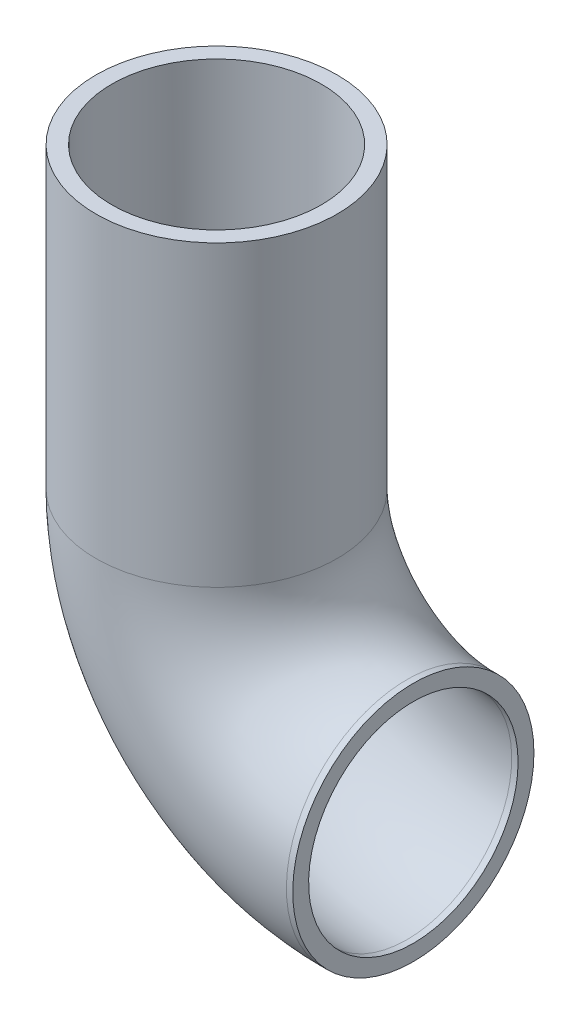
ISO-10303-21;
HEADER;
FILE_DESCRIPTION(('STEP AP214'),'2;1');
FILE_NAME('part.step','',(''),(''),'','','');
FILE_SCHEMA(('AUTOMOTIVE_DESIGN { 1 0 10303 214 1 1 1 1 }'));
ENDSEC;
DATA;
#1=APPLICATION_CONTEXT('core data for automotive mechanical design processes');
#2=APPLICATION_PROTOCOL_DEFINITION('international standard','automotive_design',2000,#1);
#3=PRODUCT_CONTEXT('',#1,'mechanical');
#4=PRODUCT('Part','Part','',(#3));
#5=PRODUCT_RELATED_PRODUCT_CATEGORY('part','',(#4));
#6=PRODUCT_DEFINITION_FORMATION('','',#4);
#7=PRODUCT_DEFINITION_CONTEXT('part definition',#1,'design');
#8=PRODUCT_DEFINITION('design','',#6,#7);
#9=PRODUCT_DEFINITION_SHAPE('','',#8);
#10=(LENGTH_UNIT() NAMED_UNIT(*) SI_UNIT(.MILLI.,.METRE.));
#11=(NAMED_UNIT(*) PLANE_ANGLE_UNIT() SI_UNIT($,.RADIAN.));
#12=(NAMED_UNIT(*) SI_UNIT($,.STERADIAN.) SOLID_ANGLE_UNIT());
#13=UNCERTAINTY_MEASURE_WITH_UNIT(LENGTH_MEASURE(1.E-05),#10,'distance_accuracy_value','');
#14=(GEOMETRIC_REPRESENTATION_CONTEXT(3) GLOBAL_UNCERTAINTY_ASSIGNED_CONTEXT((#13)) GLOBAL_UNIT_ASSIGNED_CONTEXT((#10,
#11,#12)) REPRESENTATION_CONTEXT('',''));
#15=CARTESIAN_POINT('',(0.,0.,0.));
#16=DIRECTION('',(0.,0.,1.));
#17=DIRECTION('',(1.,0.,0.));
#18=AXIS2_PLACEMENT_3D('',#15,#16,#17);
#19=CARTESIAN_POINT('',(0.,0.,0.));
#20=DIRECTION('',(1.,0.,0.));
#21=DIRECTION('',(0.,0.,-1.));
#22=AXIS2_PLACEMENT_3D('',#19,#20,#21);
#23=PLANE('',#22);
#24=CARTESIAN_POINT('',(0.,0.,0.));
#25=DIRECTION('',(1.,0.,0.));
#26=DIRECTION('',(0.,0.,-1.));
#27=AXIS2_PLACEMENT_3D('',#24,#25,#26);
#28=CIRCLE('',#27,16.5);
#29=CARTESIAN_POINT('',(0.,0.,-16.5));
#30=VERTEX_POINT('',#29);
#31=EDGE_CURVE('E54',#30,#30,#28,.T.);
#32=ORIENTED_EDGE('',*,*,#31,.F.);
#33=EDGE_LOOP('',(#32));
#34=FACE_BOUND('',#33,.T.);
#35=CARTESIAN_POINT('',(0.,0.,0.));
#36=DIRECTION('',(1.,0.,0.));
#37=DIRECTION('',(0.,0.,-1.));
#38=AXIS2_PLACEMENT_3D('',#35,#36,#37);
#39=CIRCLE('',#38,19.);
#40=CARTESIAN_POINT('',(0.,0.,-19.));
#41=VERTEX_POINT('',#40);
#42=EDGE_CURVE('E45',#41,#41,#39,.T.);
#43=ORIENTED_EDGE('',*,*,#42,.T.);
#44=EDGE_LOOP('',(#43));
#45=FACE_BOUND('',#44,.T.);
#46=ADVANCED_FACE('F31',(#34,#45),#23,.T.);
#47=CARTESIAN_POINT('',(-31.,77.,0.));
#48=DIRECTION('',(0.,-1.,0.));
#49=DIRECTION('',(0.,0.,-1.));
#50=AXIS2_PLACEMENT_3D('',#47,#48,#49);
#51=PLANE('',#50);
#52=CARTESIAN_POINT('',(-31.,77.,0.));
#53=DIRECTION('',(0.,-1.,0.));
#54=DIRECTION('',(1.,0.,0.));
#55=AXIS2_PLACEMENT_3D('',#52,#53,#54);
#56=CIRCLE('',#55,16.5);
#57=CARTESIAN_POINT('',(-14.5,77.,0.));
#58=VERTEX_POINT('',#57);
#59=EDGE_CURVE('E50',#58,#58,#56,.T.);
#60=ORIENTED_EDGE('',*,*,#59,.T.);
#61=EDGE_LOOP('',(#60));
#62=FACE_BOUND('',#61,.T.);
#63=CARTESIAN_POINT('',(-31.,77.,0.));
#64=DIRECTION('',(0.,-1.,0.));
#65=DIRECTION('',(0.,0.,-1.));
#66=AXIS2_PLACEMENT_3D('',#63,#64,#65);
#67=CIRCLE('',#66,19.);
#68=CARTESIAN_POINT('',(-31.,77.,-19.));
#69=VERTEX_POINT('',#68);
#70=EDGE_CURVE('E10',#69,#69,#67,.T.);
#71=ORIENTED_EDGE('',*,*,#70,.F.);
#72=EDGE_LOOP('',(#71));
#73=FACE_BOUND('',#72,.T.);
#74=ADVANCED_FACE('F74',(#62,#73),#51,.F.);
#75=CARTESIAN_POINT('',(0.,0.,0.));
#76=DIRECTION('',(-1.,0.,0.));
#77=DIRECTION('',(0.,-1.,0.));
#78=AXIS2_PLACEMENT_3D('',#75,#76,#77);
#79=CYLINDRICAL_SURFACE('',#78,19.);
#80=CARTESIAN_POINT('',(-0.999999999999999,0.,0.));
#81=DIRECTION('',(1.,0.,0.));
#82=DIRECTION('',(0.,0.,-1.));
#83=AXIS2_PLACEMENT_3D('',#80,#81,#82);
#84=CIRCLE('',#83,19.);
#85=CARTESIAN_POINT('',(-0.999999999999997,-19.,0.));
#86=VERTEX_POINT('',#85);
#87=EDGE_CURVE('E41',#86,#86,#84,.T.);
#88=ORIENTED_EDGE('',*,*,#87,.T.);
#89=EDGE_LOOP('',(#88));
#90=FACE_BOUND('',#89,.T.);
#91=ORIENTED_EDGE('',*,*,#42,.F.);
#92=EDGE_LOOP('',(#91));
#93=FACE_BOUND('',#92,.T.);
#94=ADVANCED_FACE('F78',(#90,#93),#79,.T.);
#95=CARTESIAN_POINT('',(-1.,30.,0.));
#96=DIRECTION('',(0.,0.,-1.));
#97=DIRECTION('',(-1.,0.,0.));
#98=AXIS2_PLACEMENT_3D('',#95,#96,#97);
#99=TOROIDAL_SURFACE('',#98,30.,19.);
#100=CARTESIAN_POINT('',(-31.,30.,0.));
#101=DIRECTION('',(0.,-1.,0.));
#102=DIRECTION('',(0.,0.,-1.));
#103=AXIS2_PLACEMENT_3D('',#100,#101,#102);
#104=CIRCLE('',#103,19.);
#105=CARTESIAN_POINT('',(-50.,30.,0.));
#106=VERTEX_POINT('',#105);
#107=EDGE_CURVE('E37',#106,#106,#104,.T.);
#108=CARTESIAN_POINT('',(-1.,30.,0.));
#109=DIRECTION('',(0.,0.,-1.));
#110=DIRECTION('',(-1.,0.,0.));
#111=AXIS2_PLACEMENT_3D('',#108,#109,#110);
#112=CIRCLE('',#111,49.);
#113=EDGE_CURVE('',#86,#106,#112,.T.);
#114=ORIENTED_EDGE('',*,*,#87,.F.);
#115=ORIENTED_EDGE('',*,*,#107,.T.);
#116=ORIENTED_EDGE('',*,*,#113,.T.);
#117=ORIENTED_EDGE('',*,*,#113,.F.);
#118=EDGE_LOOP('',(#114,#116,#115,#117));
#119=FACE_BOUND('',#118,.T.);
#120=ADVANCED_FACE('F80',(#119),#99,.T.);
#121=CARTESIAN_POINT('',(-31.,30.,0.));
#122=DIRECTION('',(0.,1.,0.));
#123=DIRECTION('',(0.,0.,1.));
#124=AXIS2_PLACEMENT_3D('',#121,#122,#123);
#125=CYLINDRICAL_SURFACE('',#124,19.);
#126=ORIENTED_EDGE('',*,*,#70,.T.);
#127=EDGE_LOOP('',(#126));
#128=FACE_BOUND('',#127,.T.);
#129=ORIENTED_EDGE('',*,*,#107,.F.);
#130=EDGE_LOOP('',(#129));
#131=FACE_BOUND('',#130,.T.);
#132=ADVANCED_FACE('F68',(#128,#131),#125,.T.);
#133=CARTESIAN_POINT('',(0.,0.,0.));
#134=DIRECTION('',(-1.,0.,0.));
#135=DIRECTION('',(0.,-1.,0.));
#136=AXIS2_PLACEMENT_3D('',#133,#134,#135);
#137=CYLINDRICAL_SURFACE('',#136,16.5);
#138=CARTESIAN_POINT('',(-0.999999999999999,0.,0.));
#139=DIRECTION('',(-1.,0.,0.));
#140=DIRECTION('',(0.,-1.,0.));
#141=AXIS2_PLACEMENT_3D('',#138,#139,#140);
#142=CIRCLE('',#141,16.5);
#143=CARTESIAN_POINT('',(-0.999999999999997,-16.5,0.));
#144=VERTEX_POINT('',#143);
#145=EDGE_CURVE('E57',#144,#144,#142,.F.);
#146=ORIENTED_EDGE('',*,*,#145,.F.);
#147=EDGE_LOOP('',(#146));
#148=FACE_BOUND('',#147,.T.);
#149=ORIENTED_EDGE('',*,*,#31,.T.);
#150=EDGE_LOOP('',(#149));
#151=FACE_BOUND('',#150,.T.);
#152=ADVANCED_FACE('F65',(#148,#151),#137,.F.);
#153=CARTESIAN_POINT('',(-1.,30.,0.));
#154=DIRECTION('',(0.,0.,-1.));
#155=DIRECTION('',(-1.,0.,0.));
#156=AXIS2_PLACEMENT_3D('',#153,#154,#155);
#157=TOROIDAL_SURFACE('',#156,30.,16.5);
#158=CARTESIAN_POINT('',(-31.,30.,0.));
#159=DIRECTION('',(0.,-1.,0.));
#160=DIRECTION('',(0.,0.,-1.));
#161=AXIS2_PLACEMENT_3D('',#158,#159,#160);
#162=CIRCLE('',#161,16.5);
#163=CARTESIAN_POINT('',(-47.5,30.,0.));
#164=VERTEX_POINT('',#163);
#165=EDGE_CURVE('E53',#164,#164,#162,.T.);
#166=CARTESIAN_POINT('',(-1.,30.,0.));
#167=DIRECTION('',(0.,0.,-1.));
#168=DIRECTION('',(-1.,0.,0.));
#169=AXIS2_PLACEMENT_3D('',#166,#167,#168);
#170=CIRCLE('',#169,46.5);
#171=EDGE_CURVE('',#144,#164,#170,.T.);
#172=ORIENTED_EDGE('',*,*,#145,.T.);
#173=ORIENTED_EDGE('',*,*,#165,.F.);
#174=ORIENTED_EDGE('',*,*,#171,.T.);
#175=ORIENTED_EDGE('',*,*,#171,.F.);
#176=EDGE_LOOP('',(#172,#174,#173,#175));
#177=FACE_BOUND('',#176,.T.);
#178=ADVANCED_FACE('F63',(#177),#157,.F.);
#179=CARTESIAN_POINT('',(-31.,30.,0.));
#180=DIRECTION('',(0.,1.,0.));
#181=DIRECTION('',(0.,0.,1.));
#182=AXIS2_PLACEMENT_3D('',#179,#180,#181);
#183=CYLINDRICAL_SURFACE('',#182,16.5);
#184=ORIENTED_EDGE('',*,*,#59,.F.);
#185=EDGE_LOOP('',(#184));
#186=FACE_BOUND('',#185,.T.);
#187=ORIENTED_EDGE('',*,*,#165,.T.);
#188=EDGE_LOOP('',(#187));
#189=FACE_BOUND('',#188,.T.);
#190=ADVANCED_FACE('F75',(#186,#189),#183,.F.);
#191=CLOSED_SHELL('',(#46,#74,#94,#120,#132,#152,#178,#190));
#192=MANIFOLD_SOLID_BREP('B2',#191);
#193=ADVANCED_BREP_SHAPE_REPRESENTATION('',(#18,#192),#14);
#194=SHAPE_DEFINITION_REPRESENTATION(#9,#193);
ENDSEC;
END-ISO-10303-21;
